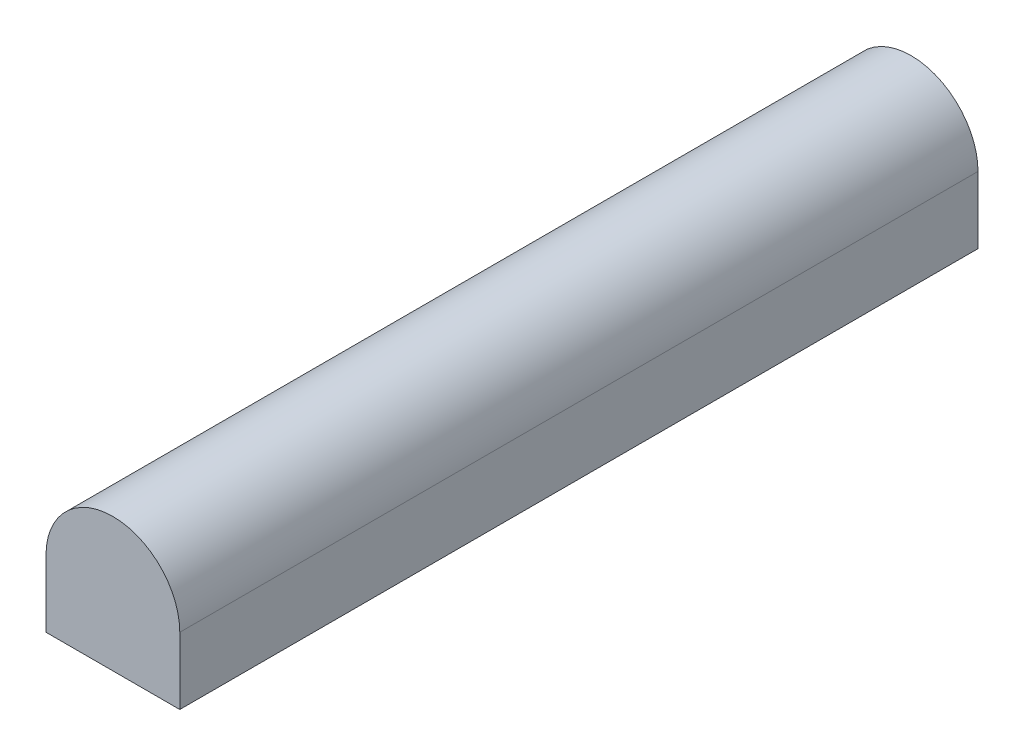
ISO-10303-21;
HEADER;
FILE_DESCRIPTION(('STEP AP214'),'2;1');
FILE_NAME('part.step','',(''),(''),'','','');
FILE_SCHEMA(('AUTOMOTIVE_DESIGN { 1 0 10303 214 1 1 1 1 }'));
ENDSEC;
DATA;
#1=APPLICATION_CONTEXT('core data for automotive mechanical design processes');
#2=APPLICATION_PROTOCOL_DEFINITION('international standard','automotive_design',2000,#1);
#3=PRODUCT_CONTEXT('',#1,'mechanical');
#4=PRODUCT('Part','Part','',(#3));
#5=PRODUCT_RELATED_PRODUCT_CATEGORY('part','',(#4));
#6=PRODUCT_DEFINITION_FORMATION('','',#4);
#7=PRODUCT_DEFINITION_CONTEXT('part definition',#1,'design');
#8=PRODUCT_DEFINITION('design','',#6,#7);
#9=PRODUCT_DEFINITION_SHAPE('','',#8);
#10=(LENGTH_UNIT() NAMED_UNIT(*) SI_UNIT(.MILLI.,.METRE.));
#11=(NAMED_UNIT(*) PLANE_ANGLE_UNIT() SI_UNIT($,.RADIAN.));
#12=(NAMED_UNIT(*) SI_UNIT($,.STERADIAN.) SOLID_ANGLE_UNIT());
#13=UNCERTAINTY_MEASURE_WITH_UNIT(LENGTH_MEASURE(1.E-05),#10,'distance_accuracy_value','');
#14=(GEOMETRIC_REPRESENTATION_CONTEXT(3) GLOBAL_UNCERTAINTY_ASSIGNED_CONTEXT((#13)) GLOBAL_UNIT_ASSIGNED_CONTEXT((#10,
#11,#12)) REPRESENTATION_CONTEXT('',''));
#15=CARTESIAN_POINT('',(0.,0.,0.));
#16=DIRECTION('',(0.,0.,1.));
#17=DIRECTION('',(1.,0.,0.));
#18=AXIS2_PLACEMENT_3D('',#15,#16,#17);
#19=CARTESIAN_POINT('',(-14.2268041237114,-9.5360824742268,89.5));
#20=DIRECTION('',(1.,0.,0.));
#21=DIRECTION('',(0.,0.,-1.));
#22=AXIS2_PLACEMENT_3D('',#19,#20,#21);
#23=PLANE('',#22);
#24=DIRECTION('',(0.,-1.,0.));
#25=VECTOR('',#24,1.);
#26=CARTESIAN_POINT('',(-14.2268041237114,-9.5360824742268,-89.5));
#27=LINE('',#26,#25);
#28=CARTESIAN_POINT('',(-14.2268041237114,5.4639175257732,-89.5));
#29=VERTEX_POINT('',#28);
#30=CARTESIAN_POINT('',(-14.2268041237114,-9.5360824742268,-89.5));
#31=VERTEX_POINT('',#30);
#32=EDGE_CURVE('E98',#29,#31,#27,.T.);
#33=ORIENTED_EDGE('',*,*,#32,.T.);
#34=DIRECTION('',(0.,0.,-1.));
#35=VECTOR('',#34,1.);
#36=CARTESIAN_POINT('',(-14.2268041237114,-9.5360824742268,89.5));
#37=LINE('',#36,#35);
#38=CARTESIAN_POINT('',(-14.2268041237114,-9.5360824742268,89.5));
#39=VERTEX_POINT('',#38);
#40=EDGE_CURVE('E11',#39,#31,#37,.T.);
#41=ORIENTED_EDGE('',*,*,#40,.F.);
#42=DIRECTION('',(0.,-1.,0.));
#43=VECTOR('',#42,1.);
#44=CARTESIAN_POINT('',(-14.2268041237114,-9.5360824742268,89.5));
#45=LINE('',#44,#43);
#46=CARTESIAN_POINT('',(-14.2268041237114,5.4639175257732,89.5));
#47=VERTEX_POINT('',#46);
#48=EDGE_CURVE('E86',#47,#39,#45,.T.);
#49=ORIENTED_EDGE('',*,*,#48,.F.);
#50=DIRECTION('',(0.,0.,-1.));
#51=VECTOR('',#50,1.);
#52=CARTESIAN_POINT('',(-14.2268041237114,5.4639175257732,89.5));
#53=LINE('',#52,#51);
#54=EDGE_CURVE('E94',#47,#29,#53,.T.);
#55=ORIENTED_EDGE('',*,*,#54,.T.);
#56=EDGE_LOOP('',(#33,#41,#49,#55));
#57=FACE_BOUND('',#56,.T.);
#58=ADVANCED_FACE('F35',(#57),#23,.F.);
#59=CARTESIAN_POINT('',(-14.2268041237114,-9.5360824742268,89.5));
#60=DIRECTION('',(0.,1.,0.));
#61=DIRECTION('',(0.,0.,1.));
#62=AXIS2_PLACEMENT_3D('',#59,#60,#61);
#63=PLANE('',#62);
#64=CARTESIAN_POINT('',(0.,-9.5360824742268,-69.5));
#65=DIRECTION('',(0.,-1.,0.));
#66=DIRECTION('',(0.,0.,-1.));
#67=AXIS2_PLACEMENT_3D('',#64,#65,#66);
#68=CIRCLE('',#67,6.);
#69=CARTESIAN_POINT('',(0.,-9.5360824742268,-75.5));
#70=VERTEX_POINT('',#69);
#71=EDGE_CURVE('E118',#70,#70,#68,.T.);
#72=ORIENTED_EDGE('',*,*,#71,.F.);
#73=EDGE_LOOP('',(#72));
#74=FACE_BOUND('',#73,.T.);
#75=CARTESIAN_POINT('',(0.,-9.5360824742268,69.5));
#76=DIRECTION('',(0.,-1.,0.));
#77=DIRECTION('',(0.,0.,-1.));
#78=AXIS2_PLACEMENT_3D('',#75,#76,#77);
#79=CIRCLE('',#78,6.);
#80=CARTESIAN_POINT('',(0.,-9.5360824742268,63.5));
#81=VERTEX_POINT('',#80);
#82=EDGE_CURVE('E112',#81,#81,#79,.T.);
#83=ORIENTED_EDGE('',*,*,#82,.F.);
#84=EDGE_LOOP('',(#83));
#85=FACE_BOUND('',#84,.T.);
#86=DIRECTION('',(1.,0.,0.));
#87=VECTOR('',#86,1.);
#88=CARTESIAN_POINT('',(-14.2268041237114,-9.5360824742268,-89.5));
#89=LINE('',#88,#87);
#90=CARTESIAN_POINT('',(15.7731958762886,-9.5360824742268,-89.5));
#91=VERTEX_POINT('',#90);
#92=EDGE_CURVE('E90',#31,#91,#89,.T.);
#93=ORIENTED_EDGE('',*,*,#92,.T.);
#94=DIRECTION('',(0.,0.,-1.));
#95=VECTOR('',#94,1.);
#96=CARTESIAN_POINT('',(15.7731958762886,-9.5360824742268,89.5));
#97=LINE('',#96,#95);
#98=CARTESIAN_POINT('',(15.7731958762886,-9.5360824742268,89.5));
#99=VERTEX_POINT('',#98);
#100=EDGE_CURVE('E43',#99,#91,#97,.T.);
#101=ORIENTED_EDGE('',*,*,#100,.F.);
#102=DIRECTION('',(1.,0.,0.));
#103=VECTOR('',#102,1.);
#104=CARTESIAN_POINT('',(-14.2268041237114,-9.5360824742268,89.5));
#105=LINE('',#104,#103);
#106=EDGE_CURVE('E81',#39,#99,#105,.T.);
#107=ORIENTED_EDGE('',*,*,#106,.F.);
#108=ORIENTED_EDGE('',*,*,#40,.T.);
#109=EDGE_LOOP('',(#93,#101,#107,#108));
#110=FACE_BOUND('',#109,.T.);
#111=ADVANCED_FACE('F89',(#74,#85,#110),#63,.F.);
#112=CARTESIAN_POINT('',(15.7731958762886,-9.5360824742268,89.5));
#113=DIRECTION('',(-1.,0.,0.));
#114=DIRECTION('',(0.,0.,1.));
#115=AXIS2_PLACEMENT_3D('',#112,#113,#114);
#116=PLANE('',#115);
#117=DIRECTION('',(0.,1.,0.));
#118=VECTOR('',#117,1.);
#119=CARTESIAN_POINT('',(15.7731958762886,-9.5360824742268,-89.5));
#120=LINE('',#119,#118);
#121=CARTESIAN_POINT('',(15.7731958762886,5.4639175257732,-89.5));
#122=VERTEX_POINT('',#121);
#123=EDGE_CURVE('E68',#91,#122,#120,.T.);
#124=ORIENTED_EDGE('',*,*,#123,.T.);
#125=DIRECTION('',(0.,0.,-1.));
#126=VECTOR('',#125,1.);
#127=CARTESIAN_POINT('',(15.7731958762886,5.4639175257732,89.5));
#128=LINE('',#127,#126);
#129=CARTESIAN_POINT('',(15.7731958762886,5.4639175257732,89.5));
#130=VERTEX_POINT('',#129);
#131=EDGE_CURVE('E91',#130,#122,#128,.T.);
#132=ORIENTED_EDGE('',*,*,#131,.F.);
#133=DIRECTION('',(0.,1.,0.));
#134=VECTOR('',#133,1.);
#135=CARTESIAN_POINT('',(15.7731958762886,-9.5360824742268,89.5));
#136=LINE('',#135,#134);
#137=EDGE_CURVE('E84',#99,#130,#136,.T.);
#138=ORIENTED_EDGE('',*,*,#137,.F.);
#139=ORIENTED_EDGE('',*,*,#100,.T.);
#140=EDGE_LOOP('',(#124,#132,#138,#139));
#141=FACE_BOUND('',#140,.T.);
#142=ADVANCED_FACE('F92',(#141),#116,.F.);
#143=CARTESIAN_POINT('',(0.773195876288648,5.4639175257732,89.5));
#144=DIRECTION('',(0.,0.,-1.));
#145=DIRECTION('',(-1.,0.,0.));
#146=AXIS2_PLACEMENT_3D('',#143,#144,#145);
#147=CYLINDRICAL_SURFACE('',#146,15.);
#148=CARTESIAN_POINT('',(0.773195876288648,5.4639175257732,-89.5));
#149=DIRECTION('',(0.,0.,1.));
#150=DIRECTION('',(1.,0.,0.));
#151=AXIS2_PLACEMENT_3D('',#148,#149,#150);
#152=CIRCLE('',#151,15.);
#153=EDGE_CURVE('E74',#122,#29,#152,.T.);
#154=ORIENTED_EDGE('',*,*,#153,.T.);
#155=ORIENTED_EDGE('',*,*,#54,.F.);
#156=CARTESIAN_POINT('',(0.773195876288648,5.4639175257732,89.5));
#157=DIRECTION('',(0.,0.,1.));
#158=DIRECTION('',(1.,0.,0.));
#159=AXIS2_PLACEMENT_3D('',#156,#157,#158);
#160=CIRCLE('',#159,15.);
#161=EDGE_CURVE('E51',#130,#47,#160,.T.);
#162=ORIENTED_EDGE('',*,*,#161,.F.);
#163=ORIENTED_EDGE('',*,*,#131,.T.);
#164=EDGE_LOOP('',(#154,#155,#162,#163));
#165=FACE_BOUND('',#164,.T.);
#166=ADVANCED_FACE('F106',(#165),#147,.T.);
#167=CARTESIAN_POINT('',(0.773195876288648,5.4639175257732,89.5));
#168=DIRECTION('',(0.,0.,1.));
#169=DIRECTION('',(1.,0.,0.));
#170=AXIS2_PLACEMENT_3D('',#167,#168,#169);
#171=PLANE('',#170);
#172=ORIENTED_EDGE('',*,*,#48,.T.);
#173=ORIENTED_EDGE('',*,*,#106,.T.);
#174=ORIENTED_EDGE('',*,*,#137,.T.);
#175=ORIENTED_EDGE('',*,*,#161,.T.);
#176=EDGE_LOOP('',(#172,#173,#174,#175));
#177=FACE_BOUND('',#176,.T.);
#178=ADVANCED_FACE('F82',(#177),#171,.T.);
#179=CARTESIAN_POINT('',(0.773195876288648,5.4639175257732,-89.5));
#180=DIRECTION('',(0.,0.,1.));
#181=DIRECTION('',(1.,0.,0.));
#182=AXIS2_PLACEMENT_3D('',#179,#180,#181);
#183=PLANE('',#182);
#184=ORIENTED_EDGE('',*,*,#32,.F.);
#185=ORIENTED_EDGE('',*,*,#153,.F.);
#186=ORIENTED_EDGE('',*,*,#123,.F.);
#187=ORIENTED_EDGE('',*,*,#92,.F.);
#188=EDGE_LOOP('',(#184,#185,#186,#187));
#189=FACE_BOUND('',#188,.T.);
#190=ADVANCED_FACE('F109',(#189),#183,.F.);
#191=CARTESIAN_POINT('',(0.,5.4639175257732,69.5));
#192=DIRECTION('',(0.,-1.,0.));
#193=DIRECTION('',(0.,0.,-1.));
#194=AXIS2_PLACEMENT_3D('',#191,#192,#193);
#195=CYLINDRICAL_SURFACE('',#194,6.);
#196=CARTESIAN_POINT('',(0.,5.4639175257732,69.5));
#197=DIRECTION('',(0.,-1.,0.));
#198=DIRECTION('',(0.,0.,-1.));
#199=AXIS2_PLACEMENT_3D('',#196,#197,#198);
#200=CIRCLE('',#199,6.);
#201=CARTESIAN_POINT('',(0.,5.4639175257732,63.5));
#202=VERTEX_POINT('',#201);
#203=EDGE_CURVE('E101',#202,#202,#200,.T.);
#204=ORIENTED_EDGE('',*,*,#203,.F.);
#205=EDGE_LOOP('',(#204));
#206=FACE_BOUND('',#205,.T.);
#207=ORIENTED_EDGE('',*,*,#82,.T.);
#208=EDGE_LOOP('',(#207));
#209=FACE_BOUND('',#208,.T.);
#210=ADVANCED_FACE('F137',(#206,#209),#195,.F.);
#211=CARTESIAN_POINT('',(0.,5.4639175257732,69.5));
#212=DIRECTION('',(0.,-1.,0.));
#213=DIRECTION('',(0.,0.,-1.));
#214=AXIS2_PLACEMENT_3D('',#211,#212,#213);
#215=PLANE('',#214);
#216=ORIENTED_EDGE('',*,*,#203,.T.);
#217=EDGE_LOOP('',(#216));
#218=FACE_BOUND('',#217,.T.);
#219=ADVANCED_FACE('F129',(#218),#215,.T.);
#220=CARTESIAN_POINT('',(0.,5.4639175257732,-69.5));
#221=DIRECTION('',(0.,-1.,0.));
#222=DIRECTION('',(0.,0.,-1.));
#223=AXIS2_PLACEMENT_3D('',#220,#221,#222);
#224=CYLINDRICAL_SURFACE('',#223,6.);
#225=CARTESIAN_POINT('',(0.,5.4639175257732,-69.5));
#226=DIRECTION('',(0.,-1.,0.));
#227=DIRECTION('',(0.,0.,-1.));
#228=AXIS2_PLACEMENT_3D('',#225,#226,#227);
#229=CIRCLE('',#228,6.);
#230=CARTESIAN_POINT('',(0.,5.4639175257732,-75.5));
#231=VERTEX_POINT('',#230);
#232=EDGE_CURVE('E115',#231,#231,#229,.T.);
#233=ORIENTED_EDGE('',*,*,#232,.F.);
#234=EDGE_LOOP('',(#233));
#235=FACE_BOUND('',#234,.T.);
#236=ORIENTED_EDGE('',*,*,#71,.T.);
#237=EDGE_LOOP('',(#236));
#238=FACE_BOUND('',#237,.T.);
#239=ADVANCED_FACE('F126',(#235,#238),#224,.F.);
#240=CARTESIAN_POINT('',(0.,5.4639175257732,-69.5));
#241=DIRECTION('',(0.,-1.,0.));
#242=DIRECTION('',(0.,0.,-1.));
#243=AXIS2_PLACEMENT_3D('',#240,#241,#242);
#244=PLANE('',#243);
#245=ORIENTED_EDGE('',*,*,#232,.T.);
#246=EDGE_LOOP('',(#245));
#247=FACE_BOUND('',#246,.T.);
#248=ADVANCED_FACE('F124',(#247),#244,.T.);
#249=CLOSED_SHELL('',(#58,#111,#142,#166,#178,#190,#210,#219,#239,#248));
#250=MANIFOLD_SOLID_BREP('B2',#249);
#251=ADVANCED_BREP_SHAPE_REPRESENTATION('',(#18,#250),#14);
#252=SHAPE_DEFINITION_REPRESENTATION(#9,#251);
ENDSEC;
END-ISO-10303-21;
